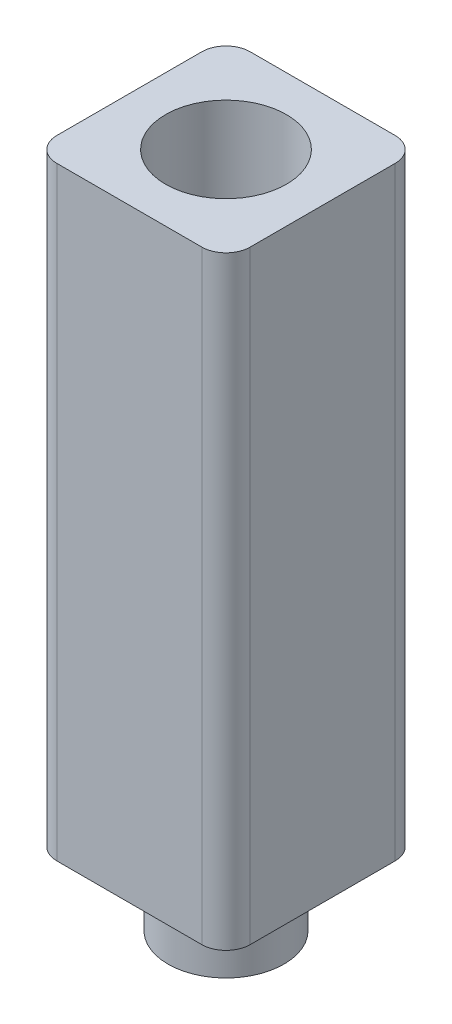
ISO-10303-21;
HEADER;
FILE_DESCRIPTION(('STEP AP214'),'2;1');
FILE_NAME('part.step','',(''),(''),'','','');
FILE_SCHEMA(('AUTOMOTIVE_DESIGN { 1 0 10303 214 1 1 1 1 }'));
ENDSEC;
DATA;
#1=APPLICATION_CONTEXT('core data for automotive mechanical design processes');
#2=APPLICATION_PROTOCOL_DEFINITION('international standard','automotive_design',2000,#1);
#3=PRODUCT_CONTEXT('',#1,'mechanical');
#4=PRODUCT('Part','Part','',(#3));
#5=PRODUCT_RELATED_PRODUCT_CATEGORY('part','',(#4));
#6=PRODUCT_DEFINITION_FORMATION('','',#4);
#7=PRODUCT_DEFINITION_CONTEXT('part definition',#1,'design');
#8=PRODUCT_DEFINITION('design','',#6,#7);
#9=PRODUCT_DEFINITION_SHAPE('','',#8);
#10=(LENGTH_UNIT() NAMED_UNIT(*) SI_UNIT(.MILLI.,.METRE.));
#11=(NAMED_UNIT(*) PLANE_ANGLE_UNIT() SI_UNIT($,.RADIAN.));
#12=(NAMED_UNIT(*) SI_UNIT($,.STERADIAN.) SOLID_ANGLE_UNIT());
#13=UNCERTAINTY_MEASURE_WITH_UNIT(LENGTH_MEASURE(1.E-05),#10,'distance_accuracy_value','');
#14=(GEOMETRIC_REPRESENTATION_CONTEXT(3) GLOBAL_UNCERTAINTY_ASSIGNED_CONTEXT((#13)) GLOBAL_UNIT_ASSIGNED_CONTEXT((#10,
#11,#12)) REPRESENTATION_CONTEXT('',''));
#15=CARTESIAN_POINT('',(0.,0.,0.));
#16=DIRECTION('',(0.,0.,1.));
#17=DIRECTION('',(1.,0.,0.));
#18=AXIS2_PLACEMENT_3D('',#15,#16,#17);
#19=CARTESIAN_POINT('',(0.,3.,0.));
#20=DIRECTION('',(0.,-1.,0.));
#21=DIRECTION('',(0.,0.,-1.));
#22=AXIS2_PLACEMENT_3D('',#19,#20,#21);
#23=CYLINDRICAL_SURFACE('',#22,2.4);
#24=CARTESIAN_POINT('',(0.,3.,0.));
#25=DIRECTION('',(0.,1.,0.));
#26=DIRECTION('',(0.,0.,1.));
#27=AXIS2_PLACEMENT_3D('',#24,#25,#26);
#28=CIRCLE('',#27,2.4);
#29=CARTESIAN_POINT('',(0.,3.,2.4));
#30=VERTEX_POINT('',#29);
#31=EDGE_CURVE('E144',#30,#30,#28,.T.);
#32=ORIENTED_EDGE('',*,*,#31,.F.);
#33=EDGE_LOOP('',(#32));
#34=FACE_BOUND('',#33,.T.);
#35=CARTESIAN_POINT('',(0.,0.,0.));
#36=DIRECTION('',(0.,1.,0.));
#37=DIRECTION('',(0.,0.,1.));
#38=AXIS2_PLACEMENT_3D('',#35,#36,#37);
#39=CIRCLE('',#38,2.4);
#40=CARTESIAN_POINT('',(0.,0.,2.4));
#41=VERTEX_POINT('',#40);
#42=EDGE_CURVE('E148',#41,#41,#39,.T.);
#43=ORIENTED_EDGE('',*,*,#42,.T.);
#44=EDGE_LOOP('',(#43));
#45=FACE_BOUND('',#44,.T.);
#46=ADVANCED_FACE('F38',(#34,#45),#23,.T.);
#47=CARTESIAN_POINT('',(0.,0.,0.));
#48=DIRECTION('',(0.,1.,0.));
#49=DIRECTION('',(0.,0.,1.));
#50=AXIS2_PLACEMENT_3D('',#47,#48,#49);
#51=PLANE('',#50);
#52=ORIENTED_EDGE('',*,*,#42,.F.);
#53=EDGE_LOOP('',(#52));
#54=FACE_BOUND('',#53,.T.);
#55=ADVANCED_FACE('F235',(#54),#51,.F.);
#56=CARTESIAN_POINT('',(4.,28.,4.));
#57=DIRECTION('',(-1.,0.,0.));
#58=DIRECTION('',(0.,0.,1.));
#59=AXIS2_PLACEMENT_3D('',#56,#57,#58);
#60=PLANE('',#59);
#61=DIRECTION('',(0.,0.,-1.));
#62=VECTOR('',#61,1.);
#63=CARTESIAN_POINT('',(4.,3.,4.));
#64=LINE('',#63,#62);
#65=CARTESIAN_POINT('',(4.,3.,3.));
#66=VERTEX_POINT('',#65);
#67=CARTESIAN_POINT('',(4.,3.,-3.));
#68=VERTEX_POINT('',#67);
#69=EDGE_CURVE('E140',#66,#68,#64,.T.);
#70=ORIENTED_EDGE('',*,*,#69,.T.);
#71=DIRECTION('',(0.,-1.,0.));
#72=VECTOR('',#71,1.);
#73=CARTESIAN_POINT('',(4.,28.,-3.));
#74=LINE('',#73,#72);
#75=CARTESIAN_POINT('',(4.,28.,-3.));
#76=VERTEX_POINT('',#75);
#77=EDGE_CURVE('E11',#68,#76,#74,.F.);
#78=ORIENTED_EDGE('',*,*,#77,.T.);
#79=DIRECTION('',(0.,0.,-1.));
#80=VECTOR('',#79,1.);
#81=CARTESIAN_POINT('',(4.,28.,4.));
#82=LINE('',#81,#80);
#83=CARTESIAN_POINT('',(4.,28.,3.));
#84=VERTEX_POINT('',#83);
#85=EDGE_CURVE('E138',#84,#76,#82,.T.);
#86=ORIENTED_EDGE('',*,*,#85,.F.);
#87=DIRECTION('',(0.,-1.,0.));
#88=VECTOR('',#87,1.);
#89=CARTESIAN_POINT('',(4.,28.,3.));
#90=LINE('',#89,#88);
#91=EDGE_CURVE('E47',#84,#66,#90,.T.);
#92=ORIENTED_EDGE('',*,*,#91,.T.);
#93=EDGE_LOOP('',(#70,#78,#86,#92));
#94=FACE_BOUND('',#93,.T.);
#95=ADVANCED_FACE('F190',(#94),#60,.F.);
#96=CARTESIAN_POINT('',(-4.,28.,-4.));
#97=DIRECTION('',(0.,0.,1.));
#98=DIRECTION('',(1.,0.,0.));
#99=AXIS2_PLACEMENT_3D('',#96,#97,#98);
#100=PLANE('',#99);
#101=DIRECTION('',(-1.,0.,0.));
#102=VECTOR('',#101,1.);
#103=CARTESIAN_POINT('',(-4.,3.,-4.));
#104=LINE('',#103,#102);
#105=CARTESIAN_POINT('',(3.,3.,-4.));
#106=VERTEX_POINT('',#105);
#107=CARTESIAN_POINT('',(-3.,3.,-4.));
#108=VERTEX_POINT('',#107);
#109=EDGE_CURVE('E134',#106,#108,#104,.T.);
#110=ORIENTED_EDGE('',*,*,#109,.T.);
#111=DIRECTION('',(0.,-1.,0.));
#112=VECTOR('',#111,1.);
#113=CARTESIAN_POINT('',(-3.,28.,-4.));
#114=LINE('',#113,#112);
#115=CARTESIAN_POINT('',(-3.,28.,-4.));
#116=VERTEX_POINT('',#115);
#117=EDGE_CURVE('E110',#108,#116,#114,.F.);
#118=ORIENTED_EDGE('',*,*,#117,.T.);
#119=DIRECTION('',(-1.,0.,0.));
#120=VECTOR('',#119,1.);
#121=CARTESIAN_POINT('',(-4.,28.,-4.));
#122=LINE('',#121,#120);
#123=CARTESIAN_POINT('',(3.,28.,-4.));
#124=VERTEX_POINT('',#123);
#125=EDGE_CURVE('E206',#124,#116,#122,.T.);
#126=ORIENTED_EDGE('',*,*,#125,.F.);
#127=DIRECTION('',(0.,-1.,0.));
#128=VECTOR('',#127,1.);
#129=CARTESIAN_POINT('',(3.,28.,-4.));
#130=LINE('',#129,#128);
#131=EDGE_CURVE('E116',#124,#106,#130,.T.);
#132=ORIENTED_EDGE('',*,*,#131,.T.);
#133=EDGE_LOOP('',(#110,#118,#126,#132));
#134=FACE_BOUND('',#133,.T.);
#135=ADVANCED_FACE('F226',(#134),#100,.F.);
#136=CARTESIAN_POINT('',(-4.,28.,4.));
#137=DIRECTION('',(1.,0.,0.));
#138=DIRECTION('',(0.,0.,-1.));
#139=AXIS2_PLACEMENT_3D('',#136,#137,#138);
#140=PLANE('',#139);
#141=DIRECTION('',(0.,0.,1.));
#142=VECTOR('',#141,1.);
#143=CARTESIAN_POINT('',(-4.,28.,4.));
#144=LINE('',#143,#142);
#145=CARTESIAN_POINT('',(-4.,28.,-3.));
#146=VERTEX_POINT('',#145);
#147=CARTESIAN_POINT('',(-4.,28.,3.));
#148=VERTEX_POINT('',#147);
#149=EDGE_CURVE('E125',#146,#148,#144,.T.);
#150=ORIENTED_EDGE('',*,*,#149,.F.);
#151=DIRECTION('',(0.,-1.,0.));
#152=VECTOR('',#151,1.);
#153=CARTESIAN_POINT('',(-4.,28.,-3.));
#154=LINE('',#153,#152);
#155=CARTESIAN_POINT('',(-4.,3.,-3.));
#156=VERTEX_POINT('',#155);
#157=EDGE_CURVE('E109',#146,#156,#154,.T.);
#158=ORIENTED_EDGE('',*,*,#157,.T.);
#159=DIRECTION('',(0.,0.,1.));
#160=VECTOR('',#159,1.);
#161=CARTESIAN_POINT('',(-4.,3.,4.));
#162=LINE('',#161,#160);
#163=CARTESIAN_POINT('',(-4.,3.,3.));
#164=VERTEX_POINT('',#163);
#165=EDGE_CURVE('E123',#156,#164,#162,.T.);
#166=ORIENTED_EDGE('',*,*,#165,.T.);
#167=DIRECTION('',(0.,-1.,0.));
#168=VECTOR('',#167,1.);
#169=CARTESIAN_POINT('',(-4.,28.,3.));
#170=LINE('',#169,#168);
#171=EDGE_CURVE('E128',#164,#148,#170,.F.);
#172=ORIENTED_EDGE('',*,*,#171,.T.);
#173=EDGE_LOOP('',(#150,#158,#166,#172));
#174=FACE_BOUND('',#173,.T.);
#175=ADVANCED_FACE('F122',(#174),#140,.F.);
#176=CARTESIAN_POINT('',(-4.,28.,4.));
#177=DIRECTION('',(0.,0.,-1.));
#178=DIRECTION('',(-1.,0.,0.));
#179=AXIS2_PLACEMENT_3D('',#176,#177,#178);
#180=PLANE('',#179);
#181=DIRECTION('',(1.,0.,0.));
#182=VECTOR('',#181,1.);
#183=CARTESIAN_POINT('',(-4.,28.,4.));
#184=LINE('',#183,#182);
#185=CARTESIAN_POINT('',(-3.,28.,4.));
#186=VERTEX_POINT('',#185);
#187=CARTESIAN_POINT('',(3.,28.,4.));
#188=VERTEX_POINT('',#187);
#189=EDGE_CURVE('E152',#186,#188,#184,.T.);
#190=ORIENTED_EDGE('',*,*,#189,.F.);
#191=DIRECTION('',(0.,-1.,0.));
#192=VECTOR('',#191,1.);
#193=CARTESIAN_POINT('',(-3.,28.,4.));
#194=LINE('',#193,#192);
#195=CARTESIAN_POINT('',(-3.,3.,4.));
#196=VERTEX_POINT('',#195);
#197=EDGE_CURVE('E180',#186,#196,#194,.T.);
#198=ORIENTED_EDGE('',*,*,#197,.T.);
#199=DIRECTION('',(1.,0.,0.));
#200=VECTOR('',#199,1.);
#201=CARTESIAN_POINT('',(-4.,3.,4.));
#202=LINE('',#201,#200);
#203=CARTESIAN_POINT('',(3.,3.,4.));
#204=VERTEX_POINT('',#203);
#205=EDGE_CURVE('E133',#196,#204,#202,.T.);
#206=ORIENTED_EDGE('',*,*,#205,.T.);
#207=DIRECTION('',(0.,-1.,0.));
#208=VECTOR('',#207,1.);
#209=CARTESIAN_POINT('',(3.,28.,4.));
#210=LINE('',#209,#208);
#211=EDGE_CURVE('E54',#204,#188,#210,.F.);
#212=ORIENTED_EDGE('',*,*,#211,.T.);
#213=EDGE_LOOP('',(#190,#198,#206,#212));
#214=FACE_BOUND('',#213,.T.);
#215=ADVANCED_FACE('F220',(#214),#180,.F.);
#216=CARTESIAN_POINT('',(0.,28.,0.));
#217=DIRECTION('',(0.,-1.,0.));
#218=DIRECTION('',(0.,0.,-1.));
#219=AXIS2_PLACEMENT_3D('',#216,#217,#218);
#220=PLANE('',#219);
#221=CARTESIAN_POINT('',(0.,28.,0.));
#222=DIRECTION('',(0.,1.,0.));
#223=DIRECTION('',(0.,0.,1.));
#224=AXIS2_PLACEMENT_3D('',#221,#222,#223);
#225=CIRCLE('',#224,2.5);
#226=CARTESIAN_POINT('',(0.,28.,2.5));
#227=VERTEX_POINT('',#226);
#228=EDGE_CURVE('E199',#227,#227,#225,.T.);
#229=ORIENTED_EDGE('',*,*,#228,.F.);
#230=EDGE_LOOP('',(#229));
#231=FACE_BOUND('',#230,.T.);
#232=ORIENTED_EDGE('',*,*,#125,.T.);
#233=CARTESIAN_POINT('',(-3.,28.,-3.));
#234=DIRECTION('',(0.,-1.,0.));
#235=DIRECTION('',(0.,0.,-1.));
#236=AXIS2_PLACEMENT_3D('',#233,#234,#235);
#237=CIRCLE('',#236,1.);
#238=EDGE_CURVE('E175',#116,#146,#237,.F.);
#239=ORIENTED_EDGE('',*,*,#238,.T.);
#240=ORIENTED_EDGE('',*,*,#149,.T.);
#241=CARTESIAN_POINT('',(-3.,28.,3.));
#242=DIRECTION('',(0.,-1.,0.));
#243=DIRECTION('',(0.,0.,-1.));
#244=AXIS2_PLACEMENT_3D('',#241,#242,#243);
#245=CIRCLE('',#244,1.);
#246=EDGE_CURVE('E61',#148,#186,#245,.F.);
#247=ORIENTED_EDGE('',*,*,#246,.T.);
#248=ORIENTED_EDGE('',*,*,#189,.T.);
#249=CARTESIAN_POINT('',(3.,28.,3.));
#250=DIRECTION('',(0.,-1.,0.));
#251=DIRECTION('',(0.,0.,-1.));
#252=AXIS2_PLACEMENT_3D('',#249,#250,#251);
#253=CIRCLE('',#252,1.);
#254=EDGE_CURVE('E167',#188,#84,#253,.F.);
#255=ORIENTED_EDGE('',*,*,#254,.T.);
#256=ORIENTED_EDGE('',*,*,#85,.T.);
#257=CARTESIAN_POINT('',(3.,28.,-3.));
#258=DIRECTION('',(0.,-1.,0.));
#259=DIRECTION('',(0.,0.,-1.));
#260=AXIS2_PLACEMENT_3D('',#257,#258,#259);
#261=CIRCLE('',#260,1.);
#262=EDGE_CURVE('E170',#76,#124,#261,.F.);
#263=ORIENTED_EDGE('',*,*,#262,.T.);
#264=EDGE_LOOP('',(#232,#239,#240,#247,#248,#255,#256,#263));
#265=FACE_BOUND('',#264,.T.);
#266=ADVANCED_FACE('F218',(#231,#265),#220,.F.);
#267=CARTESIAN_POINT('',(0.,3.,0.));
#268=DIRECTION('',(0.,-1.,0.));
#269=DIRECTION('',(0.,0.,-1.));
#270=AXIS2_PLACEMENT_3D('',#267,#268,#269);
#271=PLANE('',#270);
#272=ORIENTED_EDGE('',*,*,#31,.T.);
#273=EDGE_LOOP('',(#272));
#274=FACE_BOUND('',#273,.T.);
#275=ORIENTED_EDGE('',*,*,#165,.F.);
#276=CARTESIAN_POINT('',(-3.,3.,-3.));
#277=DIRECTION('',(0.,-1.,0.));
#278=DIRECTION('',(0.,0.,-1.));
#279=AXIS2_PLACEMENT_3D('',#276,#277,#278);
#280=CIRCLE('',#279,1.);
#281=EDGE_CURVE('E105',#156,#108,#280,.T.);
#282=ORIENTED_EDGE('',*,*,#281,.T.);
#283=ORIENTED_EDGE('',*,*,#109,.F.);
#284=CARTESIAN_POINT('',(3.,3.,-3.));
#285=DIRECTION('',(0.,-1.,0.));
#286=DIRECTION('',(0.,0.,-1.));
#287=AXIS2_PLACEMENT_3D('',#284,#285,#286);
#288=CIRCLE('',#287,1.);
#289=EDGE_CURVE('E157',#106,#68,#288,.T.);
#290=ORIENTED_EDGE('',*,*,#289,.T.);
#291=ORIENTED_EDGE('',*,*,#69,.F.);
#292=CARTESIAN_POINT('',(3.,3.,3.));
#293=DIRECTION('',(0.,-1.,0.));
#294=DIRECTION('',(0.,0.,-1.));
#295=AXIS2_PLACEMENT_3D('',#292,#293,#294);
#296=CIRCLE('',#295,1.);
#297=EDGE_CURVE('E127',#66,#204,#296,.T.);
#298=ORIENTED_EDGE('',*,*,#297,.T.);
#299=ORIENTED_EDGE('',*,*,#205,.F.);
#300=CARTESIAN_POINT('',(-3.,3.,3.));
#301=DIRECTION('',(0.,-1.,0.));
#302=DIRECTION('',(0.,0.,-1.));
#303=AXIS2_PLACEMENT_3D('',#300,#301,#302);
#304=CIRCLE('',#303,1.);
#305=EDGE_CURVE('E117',#196,#164,#304,.T.);
#306=ORIENTED_EDGE('',*,*,#305,.T.);
#307=EDGE_LOOP('',(#275,#282,#283,#290,#291,#298,#299,#306));
#308=FACE_BOUND('',#307,.T.);
#309=ADVANCED_FACE('F130',(#274,#308),#271,.T.);
#310=CARTESIAN_POINT('',(0.,24.,0.));
#311=DIRECTION('',(0.,1.,0.));
#312=DIRECTION('',(0.,0.,1.));
#313=AXIS2_PLACEMENT_3D('',#310,#311,#312);
#314=CYLINDRICAL_SURFACE('',#313,2.5);
#315=CARTESIAN_POINT('',(0.,24.,0.));
#316=DIRECTION('',(0.,1.,0.));
#317=DIRECTION('',(0.,0.,1.));
#318=AXIS2_PLACEMENT_3D('',#315,#316,#317);
#319=CIRCLE('',#318,2.5);
#320=CARTESIAN_POINT('',(0.,24.,2.5));
#321=VERTEX_POINT('',#320);
#322=EDGE_CURVE('E196',#321,#321,#319,.T.);
#323=ORIENTED_EDGE('',*,*,#322,.F.);
#324=EDGE_LOOP('',(#323));
#325=FACE_BOUND('',#324,.T.);
#326=ORIENTED_EDGE('',*,*,#228,.T.);
#327=EDGE_LOOP('',(#326));
#328=FACE_BOUND('',#327,.T.);
#329=ADVANCED_FACE('F216',(#325,#328),#314,.F.);
#330=CARTESIAN_POINT('',(0.,24.,0.));
#331=DIRECTION('',(0.,1.,0.));
#332=DIRECTION('',(0.,0.,1.));
#333=AXIS2_PLACEMENT_3D('',#330,#331,#332);
#334=PLANE('',#333);
#335=ORIENTED_EDGE('',*,*,#322,.T.);
#336=EDGE_LOOP('',(#335));
#337=FACE_BOUND('',#336,.T.);
#338=ADVANCED_FACE('F249',(#337),#334,.T.);
#339=CARTESIAN_POINT('',(-3.,28.,-3.));
#340=DIRECTION('',(0.,-1.,0.));
#341=DIRECTION('',(0.,0.,-1.));
#342=AXIS2_PLACEMENT_3D('',#339,#340,#341);
#343=CYLINDRICAL_SURFACE('',#342,1.);
#344=ORIENTED_EDGE('',*,*,#238,.F.);
#345=ORIENTED_EDGE('',*,*,#117,.F.);
#346=ORIENTED_EDGE('',*,*,#281,.F.);
#347=ORIENTED_EDGE('',*,*,#157,.F.);
#348=EDGE_LOOP('',(#344,#345,#346,#347));
#349=FACE_BOUND('',#348,.T.);
#350=ADVANCED_FACE('F108',(#349),#343,.T.);
#351=CARTESIAN_POINT('',(-3.,28.,3.));
#352=DIRECTION('',(0.,-1.,0.));
#353=DIRECTION('',(0.,0.,-1.));
#354=AXIS2_PLACEMENT_3D('',#351,#352,#353);
#355=CYLINDRICAL_SURFACE('',#354,1.);
#356=ORIENTED_EDGE('',*,*,#246,.F.);
#357=ORIENTED_EDGE('',*,*,#171,.F.);
#358=ORIENTED_EDGE('',*,*,#305,.F.);
#359=ORIENTED_EDGE('',*,*,#197,.F.);
#360=EDGE_LOOP('',(#356,#357,#358,#359));
#361=FACE_BOUND('',#360,.T.);
#362=ADVANCED_FACE('F233',(#361),#355,.T.);
#363=CARTESIAN_POINT('',(3.,28.,-3.));
#364=DIRECTION('',(0.,-1.,0.));
#365=DIRECTION('',(0.,0.,-1.));
#366=AXIS2_PLACEMENT_3D('',#363,#364,#365);
#367=CYLINDRICAL_SURFACE('',#366,1.);
#368=ORIENTED_EDGE('',*,*,#262,.F.);
#369=ORIENTED_EDGE('',*,*,#77,.F.);
#370=ORIENTED_EDGE('',*,*,#289,.F.);
#371=ORIENTED_EDGE('',*,*,#131,.F.);
#372=EDGE_LOOP('',(#368,#369,#370,#371));
#373=FACE_BOUND('',#372,.T.);
#374=ADVANCED_FACE('F228',(#373),#367,.T.);
#375=CARTESIAN_POINT('',(3.,28.,3.));
#376=DIRECTION('',(0.,-1.,0.));
#377=DIRECTION('',(0.,0.,-1.));
#378=AXIS2_PLACEMENT_3D('',#375,#376,#377);
#379=CYLINDRICAL_SURFACE('',#378,1.);
#380=ORIENTED_EDGE('',*,*,#254,.F.);
#381=ORIENTED_EDGE('',*,*,#211,.F.);
#382=ORIENTED_EDGE('',*,*,#297,.F.);
#383=ORIENTED_EDGE('',*,*,#91,.F.);
#384=EDGE_LOOP('',(#380,#381,#382,#383));
#385=FACE_BOUND('',#384,.T.);
#386=ADVANCED_FACE('F40',(#385),#379,.T.);
#387=CLOSED_SHELL('',(#46,#55,#95,#135,#175,#215,#266,#309,#329,#338,#350,#362,#374,#386));
#388=MANIFOLD_SOLID_BREP('B2',#387);
#389=ADVANCED_BREP_SHAPE_REPRESENTATION('',(#18,#388),#14);
#390=SHAPE_DEFINITION_REPRESENTATION(#9,#389);
ENDSEC;
END-ISO-10303-21;
